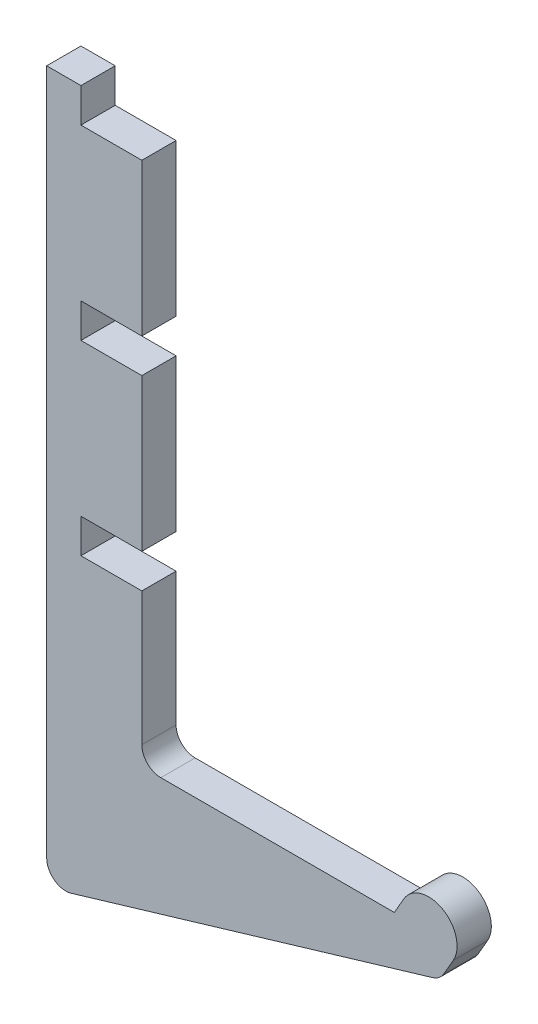
ISO-10303-21;
HEADER;
FILE_DESCRIPTION(('STEP AP214'),'2;1');
FILE_NAME('part.step','',(''),(''),'','','');
FILE_SCHEMA(('AUTOMOTIVE_DESIGN { 1 0 10303 214 1 1 1 1 }'));
ENDSEC;
DATA;
#1=APPLICATION_CONTEXT('core data for automotive mechanical design processes');
#2=APPLICATION_PROTOCOL_DEFINITION('international standard','automotive_design',2000,#1);
#3=PRODUCT_CONTEXT('',#1,'mechanical');
#4=PRODUCT('Part','Part','',(#3));
#5=PRODUCT_RELATED_PRODUCT_CATEGORY('part','',(#4));
#6=PRODUCT_DEFINITION_FORMATION('','',#4);
#7=PRODUCT_DEFINITION_CONTEXT('part definition',#1,'design');
#8=PRODUCT_DEFINITION('design','',#6,#7);
#9=PRODUCT_DEFINITION_SHAPE('','',#8);
#10=(LENGTH_UNIT() NAMED_UNIT(*) SI_UNIT(.MILLI.,.METRE.));
#11=(NAMED_UNIT(*) PLANE_ANGLE_UNIT() SI_UNIT($,.RADIAN.));
#12=(NAMED_UNIT(*) SI_UNIT($,.STERADIAN.) SOLID_ANGLE_UNIT());
#13=UNCERTAINTY_MEASURE_WITH_UNIT(LENGTH_MEASURE(1.E-05),#10,'distance_accuracy_value','');
#14=(GEOMETRIC_REPRESENTATION_CONTEXT(3) GLOBAL_UNCERTAINTY_ASSIGNED_CONTEXT((#13)) GLOBAL_UNIT_ASSIGNED_CONTEXT((#10,
#11,#12)) REPRESENTATION_CONTEXT('',''));
#15=CARTESIAN_POINT('',(0.,0.,0.));
#16=DIRECTION('',(0.,0.,1.));
#17=DIRECTION('',(1.,0.,0.));
#18=AXIS2_PLACEMENT_3D('',#15,#16,#17);
#19=CARTESIAN_POINT('',(200.,310.,18.));
#20=DIRECTION('',(0.,0.,-1.));
#21=DIRECTION('',(-1.,0.,0.));
#22=AXIS2_PLACEMENT_3D('',#19,#20,#21);
#23=CYLINDRICAL_SURFACE('',#22,10.);
#24=DIRECTION('',(0.,0.,1.));
#25=VECTOR('',#24,1.);
#26=CARTESIAN_POINT('',(208.660254037844,305.,0.));
#27=LINE('',#26,#25);
#28=CARTESIAN_POINT('',(208.660254037844,305.,0.));
#29=VERTEX_POINT('',#28);
#30=CARTESIAN_POINT('',(208.660254037844,305.,18.));
#31=VERTEX_POINT('',#30);
#32=EDGE_CURVE('E178',#29,#31,#27,.T.);
#33=ORIENTED_EDGE('',*,*,#32,.T.);
#34=CARTESIAN_POINT('',(200.,310.,18.));
#35=DIRECTION('',(0.,0.,1.));
#36=DIRECTION('',(1.,0.,0.));
#37=AXIS2_PLACEMENT_3D('',#34,#35,#36);
#38=CIRCLE('',#37,10.);
#39=CARTESIAN_POINT('',(202.85438916302,300.416030962799,18.));
#40=VERTEX_POINT('',#39);
#41=EDGE_CURVE('E257',#40,#31,#38,.T.);
#42=ORIENTED_EDGE('',*,*,#41,.F.);
#43=DIRECTION('',(0.,0.,-1.));
#44=VECTOR('',#43,1.);
#45=CARTESIAN_POINT('',(202.85438916302,300.416030962799,18.));
#46=LINE('',#45,#44);
#47=CARTESIAN_POINT('',(202.85438916302,300.416030962799,0.));
#48=VERTEX_POINT('',#47);
#49=EDGE_CURVE('E204',#40,#48,#46,.T.);
#50=ORIENTED_EDGE('',*,*,#49,.T.);
#51=CARTESIAN_POINT('',(200.,310.,0.));
#52=DIRECTION('',(0.,0.,1.));
#53=DIRECTION('',(1.,0.,0.));
#54=AXIS2_PLACEMENT_3D('',#51,#52,#53);
#55=CIRCLE('',#54,10.);
#56=EDGE_CURVE('E197',#48,#29,#55,.T.);
#57=ORIENTED_EDGE('',*,*,#56,.T.);
#58=EDGE_LOOP('',(#33,#42,#50,#57));
#59=FACE_BOUND('',#58,.T.);
#60=ADVANCED_FACE('F34',(#59),#23,.T.);
#61=CARTESIAN_POINT('',(50.,330.,18.));
#62=DIRECTION('',(-1.,0.,0.));
#63=DIRECTION('',(0.,0.,1.));
#64=AXIS2_PLACEMENT_3D('',#61,#62,#63);
#65=PLANE('',#64);
#66=DIRECTION('',(0.,1.,0.));
#67=VECTOR('',#66,1.);
#68=CARTESIAN_POINT('',(50.,330.,0.));
#69=LINE('',#68,#67);
#70=CARTESIAN_POINT('',(50.,330.,0.));
#71=VERTEX_POINT('',#70);
#72=CARTESIAN_POINT('',(50.,400.,0.));
#73=VERTEX_POINT('',#72);
#74=EDGE_CURVE('E216',#71,#73,#69,.T.);
#75=ORIENTED_EDGE('',*,*,#74,.T.);
#76=DIRECTION('',(0.,0.,1.));
#77=VECTOR('',#76,1.);
#78=CARTESIAN_POINT('',(50.,400.,0.));
#79=LINE('',#78,#77);
#80=CARTESIAN_POINT('',(50.,400.,18.));
#81=VERTEX_POINT('',#80);
#82=EDGE_CURVE('E303',#73,#81,#79,.T.);
#83=ORIENTED_EDGE('',*,*,#82,.T.);
#84=DIRECTION('',(0.,1.,0.));
#85=VECTOR('',#84,1.);
#86=CARTESIAN_POINT('',(50.,330.,18.));
#87=LINE('',#86,#85);
#88=CARTESIAN_POINT('',(50.,330.,18.));
#89=VERTEX_POINT('',#88);
#90=EDGE_CURVE('E225',#89,#81,#87,.T.);
#91=ORIENTED_EDGE('',*,*,#90,.F.);
#92=DIRECTION('',(0.,0.,-1.));
#93=VECTOR('',#92,1.);
#94=CARTESIAN_POINT('',(50.,330.,18.));
#95=LINE('',#94,#93);
#96=EDGE_CURVE('E221',#89,#71,#95,.T.);
#97=ORIENTED_EDGE('',*,*,#96,.T.);
#98=EDGE_LOOP('',(#75,#83,#91,#97));
#99=FACE_BOUND('',#98,.T.);
#100=ADVANCED_FACE('F364',(#99),#65,.F.);
#101=CARTESIAN_POINT('',(50.,418.,18.));
#102=VERTEX_POINT('',#101);
#103=CARTESIAN_POINT('',(50.,498.,18.));
#104=VERTEX_POINT('',#103);
#105=EDGE_CURVE('E251',#102,#104,#87,.T.);
#106=ORIENTED_EDGE('',*,*,#105,.F.);
#107=DIRECTION('',(0.,0.,1.));
#108=VECTOR('',#107,1.);
#109=CARTESIAN_POINT('',(50.,418.,0.));
#110=LINE('',#109,#108);
#111=CARTESIAN_POINT('',(50.,418.,0.));
#112=VERTEX_POINT('',#111);
#113=EDGE_CURVE('E311',#112,#102,#110,.T.);
#114=ORIENTED_EDGE('',*,*,#113,.F.);
#115=CARTESIAN_POINT('',(50.,498.,0.));
#116=VERTEX_POINT('',#115);
#117=EDGE_CURVE('E220',#112,#116,#69,.T.);
#118=ORIENTED_EDGE('',*,*,#117,.T.);
#119=DIRECTION('',(0.,0.,1.));
#120=VECTOR('',#119,1.);
#121=CARTESIAN_POINT('',(50.,498.,0.));
#122=LINE('',#121,#120);
#123=EDGE_CURVE('E279',#116,#104,#122,.T.);
#124=ORIENTED_EDGE('',*,*,#123,.T.);
#125=EDGE_LOOP('',(#106,#114,#118,#124));
#126=FACE_BOUND('',#125,.T.);
#127=ADVANCED_FACE('F375',(#126),#65,.F.);
#128=CARTESIAN_POINT('',(50.,614.,18.));
#129=DIRECTION('',(0.,-1.,0.));
#130=DIRECTION('',(0.,0.,-1.));
#131=AXIS2_PLACEMENT_3D('',#128,#129,#130);
#132=PLANE('',#131);
#133=DIRECTION('',(-1.,0.,0.));
#134=VECTOR('',#133,1.);
#135=CARTESIAN_POINT('',(50.,614.,18.));
#136=LINE('',#135,#134);
#137=CARTESIAN_POINT('',(18.0000000000001,614.,18.));
#138=VERTEX_POINT('',#137);
#139=CARTESIAN_POINT('',(0.,614.,18.));
#140=VERTEX_POINT('',#139);
#141=EDGE_CURVE('E219',#138,#140,#136,.T.);
#142=ORIENTED_EDGE('',*,*,#141,.F.);
#143=DIRECTION('',(0.,0.,1.));
#144=VECTOR('',#143,1.);
#145=CARTESIAN_POINT('',(18.0000000000001,614.,0.));
#146=LINE('',#145,#144);
#147=CARTESIAN_POINT('',(18.0000000000001,614.,0.));
#148=VERTEX_POINT('',#147);
#149=EDGE_CURVE('E248',#148,#138,#146,.T.);
#150=ORIENTED_EDGE('',*,*,#149,.F.);
#151=DIRECTION('',(-1.,0.,0.));
#152=VECTOR('',#151,1.);
#153=CARTESIAN_POINT('',(50.,614.,0.));
#154=LINE('',#153,#152);
#155=CARTESIAN_POINT('',(0.,614.,0.));
#156=VERTEX_POINT('',#155);
#157=EDGE_CURVE('E244',#148,#156,#154,.T.);
#158=ORIENTED_EDGE('',*,*,#157,.T.);
#159=DIRECTION('',(0.,0.,-1.));
#160=VECTOR('',#159,1.);
#161=CARTESIAN_POINT('',(0.,614.,18.));
#162=LINE('',#161,#160);
#163=EDGE_CURVE('E11',#140,#156,#162,.T.);
#164=ORIENTED_EDGE('',*,*,#163,.F.);
#165=EDGE_LOOP('',(#142,#150,#158,#164));
#166=FACE_BOUND('',#165,.T.);
#167=ADVANCED_FACE('F36',(#166),#132,.F.);
#168=CARTESIAN_POINT('',(0.,614.,18.));
#169=DIRECTION('',(1.,0.,0.));
#170=DIRECTION('',(0.,1.,0.));
#171=AXIS2_PLACEMENT_3D('',#168,#169,#170);
#172=PLANE('',#171);
#173=DIRECTION('',(0.,-1.,0.));
#174=VECTOR('',#173,1.);
#175=CARTESIAN_POINT('',(0.,614.,0.));
#176=LINE('',#175,#174);
#177=CARTESIAN_POINT('',(0.,253.412385946913,0.));
#178=VERTEX_POINT('',#177);
#179=EDGE_CURVE('E243',#156,#178,#176,.T.);
#180=ORIENTED_EDGE('',*,*,#179,.T.);
#181=DIRECTION('',(0.,0.,-1.));
#182=VECTOR('',#181,1.);
#183=CARTESIAN_POINT('',(0.,253.412385946913,18.));
#184=LINE('',#183,#182);
#185=CARTESIAN_POINT('',(0.,253.412385946913,18.));
#186=VERTEX_POINT('',#185);
#187=EDGE_CURVE('E42',#186,#178,#184,.T.);
#188=ORIENTED_EDGE('',*,*,#187,.F.);
#189=DIRECTION('',(0.,-1.,0.));
#190=VECTOR('',#189,1.);
#191=CARTESIAN_POINT('',(0.,614.,18.));
#192=LINE('',#191,#190);
#193=EDGE_CURVE('E262',#140,#186,#192,.T.);
#194=ORIENTED_EDGE('',*,*,#193,.F.);
#195=ORIENTED_EDGE('',*,*,#163,.T.);
#196=EDGE_LOOP('',(#180,#188,#194,#195));
#197=FACE_BOUND('',#196,.T.);
#198=ADVANCED_FACE('F397',(#197),#172,.F.);
#199=CARTESIAN_POINT('',(10.0000000000001,253.412385946913,18.));
#200=DIRECTION('',(0.,0.,-1.));
#201=DIRECTION('',(-1.,0.,0.));
#202=AXIS2_PLACEMENT_3D('',#199,#200,#201);
#203=CYLINDRICAL_SURFACE('',#202,9.99999999999998);
#204=CARTESIAN_POINT('',(10.0000000000001,253.412385946913,0.));
#205=DIRECTION('',(0.,0.,1.));
#206=DIRECTION('',(1.,0.,0.));
#207=AXIS2_PLACEMENT_3D('',#204,#205,#206);
#208=CIRCLE('',#207,9.99999999999998);
#209=CARTESIAN_POINT('',(12.8543891630206,243.828416909712,0.));
#210=VERTEX_POINT('',#209);
#211=EDGE_CURVE('E210',#178,#210,#208,.T.);
#212=ORIENTED_EDGE('',*,*,#211,.T.);
#213=DIRECTION('',(0.,0.,-1.));
#214=VECTOR('',#213,1.);
#215=CARTESIAN_POINT('',(12.8543891630206,243.828416909712,18.));
#216=LINE('',#215,#214);
#217=CARTESIAN_POINT('',(12.8543891630206,243.828416909712,18.));
#218=VERTEX_POINT('',#217);
#219=EDGE_CURVE('E229',#218,#210,#216,.T.);
#220=ORIENTED_EDGE('',*,*,#219,.F.);
#221=CARTESIAN_POINT('',(10.0000000000001,253.412385946913,18.));
#222=DIRECTION('',(0.,0.,1.));
#223=DIRECTION('',(1.,0.,0.));
#224=AXIS2_PLACEMENT_3D('',#221,#222,#223);
#225=CIRCLE('',#224,9.99999999999998);
#226=EDGE_CURVE('E238',#186,#218,#225,.T.);
#227=ORIENTED_EDGE('',*,*,#226,.F.);
#228=ORIENTED_EDGE('',*,*,#187,.T.);
#229=EDGE_LOOP('',(#212,#220,#227,#228));
#230=FACE_BOUND('',#229,.T.);
#231=ADVANCED_FACE('F236',(#230),#203,.T.);
#232=CARTESIAN_POINT('',(12.8543891630206,243.828416909712,18.));
#233=DIRECTION('',(-0.285438916302043,0.958396903720121,0.));
#234=DIRECTION('',(-0.958396903720121,-0.285438916302043,0.));
#235=AXIS2_PLACEMENT_3D('',#232,#233,#234);
#236=PLANE('',#235);
#237=DIRECTION('',(0.958396903720121,0.285438916302043,0.));
#238=VECTOR('',#237,1.);
#239=CARTESIAN_POINT('',(12.8543891630206,243.828416909712,0.));
#240=LINE('',#239,#238);
#241=EDGE_CURVE('E206',#210,#48,#240,.T.);
#242=ORIENTED_EDGE('',*,*,#241,.T.);
#243=ORIENTED_EDGE('',*,*,#49,.F.);
#244=DIRECTION('',(0.958396903720121,0.285438916302043,0.));
#245=VECTOR('',#244,1.);
#246=CARTESIAN_POINT('',(12.8543891630206,243.828416909712,18.));
#247=LINE('',#246,#245);
#248=EDGE_CURVE('E259',#218,#40,#247,.T.);
#249=ORIENTED_EDGE('',*,*,#248,.F.);
#250=ORIENTED_EDGE('',*,*,#219,.T.);
#251=EDGE_LOOP('',(#242,#243,#249,#250));
#252=FACE_BOUND('',#251,.T.);
#253=ADVANCED_FACE('F403',(#252),#236,.F.);
#254=CARTESIAN_POINT('',(200.,320.,18.));
#255=DIRECTION('',(0.,-1.,0.));
#256=DIRECTION('',(0.,0.,-1.));
#257=AXIS2_PLACEMENT_3D('',#254,#255,#256);
#258=PLANE('',#257);
#259=DIRECTION('',(-1.,0.,0.));
#260=VECTOR('',#259,1.);
#261=CARTESIAN_POINT('',(200.,320.,18.));
#262=LINE('',#261,#260);
#263=CARTESIAN_POINT('',(182.679491924311,320.,18.));
#264=VERTEX_POINT('',#263);
#265=CARTESIAN_POINT('',(60.0000000000001,320.,18.));
#266=VERTEX_POINT('',#265);
#267=EDGE_CURVE('E255',#264,#266,#262,.T.);
#268=ORIENTED_EDGE('',*,*,#267,.F.);
#269=DIRECTION('',(0.,0.,1.));
#270=VECTOR('',#269,1.);
#271=CARTESIAN_POINT('',(182.679491924311,320.,0.));
#272=LINE('',#271,#270);
#273=CARTESIAN_POINT('',(182.679491924311,320.,0.));
#274=VERTEX_POINT('',#273);
#275=EDGE_CURVE('E329',#274,#264,#272,.T.);
#276=ORIENTED_EDGE('',*,*,#275,.F.);
#277=DIRECTION('',(-1.,0.,0.));
#278=VECTOR('',#277,1.);
#279=CARTESIAN_POINT('',(200.,320.,0.));
#280=LINE('',#279,#278);
#281=CARTESIAN_POINT('',(60.0000000000001,320.,0.));
#282=VERTEX_POINT('',#281);
#283=EDGE_CURVE('E205',#274,#282,#280,.T.);
#284=ORIENTED_EDGE('',*,*,#283,.T.);
#285=DIRECTION('',(0.,0.,-1.));
#286=VECTOR('',#285,1.);
#287=CARTESIAN_POINT('',(60.0000000000001,320.,18.));
#288=LINE('',#287,#286);
#289=EDGE_CURVE('E224',#266,#282,#288,.T.);
#290=ORIENTED_EDGE('',*,*,#289,.F.);
#291=EDGE_LOOP('',(#268,#276,#284,#290));
#292=FACE_BOUND('',#291,.T.);
#293=ADVANCED_FACE('F353',(#292),#258,.F.);
#294=CARTESIAN_POINT('',(60.,330.,18.));
#295=DIRECTION('',(0.,0.,-1.));
#296=DIRECTION('',(-1.,0.,0.));
#297=AXIS2_PLACEMENT_3D('',#294,#295,#296);
#298=CYLINDRICAL_SURFACE('',#297,10.);
#299=CARTESIAN_POINT('',(60.,330.,0.));
#300=DIRECTION('',(0.,0.,-1.));
#301=DIRECTION('',(-1.,0.,0.));
#302=AXIS2_PLACEMENT_3D('',#299,#300,#301);
#303=CIRCLE('',#302,10.);
#304=EDGE_CURVE('E208',#282,#71,#303,.T.);
#305=ORIENTED_EDGE('',*,*,#304,.T.);
#306=ORIENTED_EDGE('',*,*,#96,.F.);
#307=CARTESIAN_POINT('',(60.,330.,18.));
#308=DIRECTION('',(0.,0.,-1.));
#309=DIRECTION('',(-1.,0.,0.));
#310=AXIS2_PLACEMENT_3D('',#307,#308,#309);
#311=CIRCLE('',#310,10.);
#312=EDGE_CURVE('E253',#266,#89,#311,.T.);
#313=ORIENTED_EDGE('',*,*,#312,.F.);
#314=ORIENTED_EDGE('',*,*,#289,.T.);
#315=EDGE_LOOP('',(#305,#306,#313,#314));
#316=FACE_BOUND('',#315,.T.);
#317=ADVANCED_FACE('F361',(#316),#298,.F.);
#318=CARTESIAN_POINT('',(50.,516.,18.));
#319=VERTEX_POINT('',#318);
#320=CARTESIAN_POINT('',(50.,596.,18.));
#321=VERTEX_POINT('',#320);
#322=EDGE_CURVE('E252',#319,#321,#87,.T.);
#323=ORIENTED_EDGE('',*,*,#322,.F.);
#324=DIRECTION('',(0.,0.,1.));
#325=VECTOR('',#324,1.);
#326=CARTESIAN_POINT('',(50.,516.,0.));
#327=LINE('',#326,#325);
#328=CARTESIAN_POINT('',(50.,516.,0.));
#329=VERTEX_POINT('',#328);
#330=EDGE_CURVE('E284',#329,#319,#327,.T.);
#331=ORIENTED_EDGE('',*,*,#330,.F.);
#332=CARTESIAN_POINT('',(50.,596.,0.));
#333=VERTEX_POINT('',#332);
#334=EDGE_CURVE('E215',#329,#333,#69,.T.);
#335=ORIENTED_EDGE('',*,*,#334,.T.);
#336=DIRECTION('',(0.,0.,1.));
#337=VECTOR('',#336,1.);
#338=CARTESIAN_POINT('',(50.,596.,0.));
#339=LINE('',#338,#337);
#340=EDGE_CURVE('E267',#333,#321,#339,.T.);
#341=ORIENTED_EDGE('',*,*,#340,.T.);
#342=EDGE_LOOP('',(#323,#331,#335,#341));
#343=FACE_BOUND('',#342,.T.);
#344=ADVANCED_FACE('F389',(#343),#65,.F.);
#345=CARTESIAN_POINT('',(10.0000000000001,253.412385946913,18.));
#346=DIRECTION('',(0.,0.,1.));
#347=DIRECTION('',(1.,0.,0.));
#348=AXIS2_PLACEMENT_3D('',#345,#346,#347);
#349=PLANE('',#348);
#350=ORIENTED_EDGE('',*,*,#41,.T.);
#351=DIRECTION('',(0.499999999999984,0.866025403784448,0.));
#352=VECTOR('',#351,1.);
#353=CARTESIAN_POINT('',(208.660254037844,305.,18.));
#354=LINE('',#353,#352);
#355=CARTESIAN_POINT('',(213.660254037844,313.660254037844,18.));
#356=VERTEX_POINT('',#355);
#357=EDGE_CURVE('E183',#31,#356,#354,.T.);
#358=ORIENTED_EDGE('',*,*,#357,.T.);
#359=CARTESIAN_POINT('',(200.669872981078,321.160254037844,18.));
#360=DIRECTION('',(0.,0.,1.));
#361=DIRECTION('',(-1.,0.,0.));
#362=AXIS2_PLACEMENT_3D('',#359,#360,#361);
#363=CIRCLE('',#362,14.9999999999999);
#364=CARTESIAN_POINT('',(187.679491924311,328.660254037844,18.));
#365=VERTEX_POINT('',#364);
#366=EDGE_CURVE('E340',#356,#365,#363,.T.);
#367=ORIENTED_EDGE('',*,*,#366,.T.);
#368=DIRECTION('',(-0.500000000000003,-0.866025403784437,0.));
#369=VECTOR('',#368,1.);
#370=CARTESIAN_POINT('',(187.679491924311,328.660254037844,18.));
#371=LINE('',#370,#369);
#372=EDGE_CURVE('E49',#365,#264,#371,.T.);
#373=ORIENTED_EDGE('',*,*,#372,.T.);
#374=ORIENTED_EDGE('',*,*,#267,.T.);
#375=ORIENTED_EDGE('',*,*,#312,.T.);
#376=ORIENTED_EDGE('',*,*,#90,.T.);
#377=DIRECTION('',(1.,0.,0.));
#378=VECTOR('',#377,1.);
#379=CARTESIAN_POINT('',(50.,400.,18.));
#380=LINE('',#379,#378);
#381=CARTESIAN_POINT('',(18.0000000000001,400.,18.));
#382=VERTEX_POINT('',#381);
#383=EDGE_CURVE('E320',#382,#81,#380,.T.);
#384=ORIENTED_EDGE('',*,*,#383,.F.);
#385=DIRECTION('',(0.,-1.,0.));
#386=VECTOR('',#385,1.);
#387=CARTESIAN_POINT('',(18.0000000000001,418.,18.));
#388=LINE('',#387,#386);
#389=CARTESIAN_POINT('',(18.0000000000001,418.,18.));
#390=VERTEX_POINT('',#389);
#391=EDGE_CURVE('E323',#390,#382,#388,.T.);
#392=ORIENTED_EDGE('',*,*,#391,.F.);
#393=DIRECTION('',(-1.,0.,0.));
#394=VECTOR('',#393,1.);
#395=CARTESIAN_POINT('',(50.,418.,18.));
#396=LINE('',#395,#394);
#397=EDGE_CURVE('E326',#102,#390,#396,.T.);
#398=ORIENTED_EDGE('',*,*,#397,.F.);
#399=ORIENTED_EDGE('',*,*,#105,.T.);
#400=DIRECTION('',(1.,0.,0.));
#401=VECTOR('',#400,1.);
#402=CARTESIAN_POINT('',(50.,498.,18.));
#403=LINE('',#402,#401);
#404=CARTESIAN_POINT('',(18.0000000000001,498.,18.));
#405=VERTEX_POINT('',#404);
#406=EDGE_CURVE('E293',#405,#104,#403,.T.);
#407=ORIENTED_EDGE('',*,*,#406,.F.);
#408=DIRECTION('',(0.,-1.,0.));
#409=VECTOR('',#408,1.);
#410=CARTESIAN_POINT('',(18.0000000000001,516.,18.));
#411=LINE('',#410,#409);
#412=CARTESIAN_POINT('',(18.0000000000001,516.,18.));
#413=VERTEX_POINT('',#412);
#414=EDGE_CURVE('E297',#413,#405,#411,.T.);
#415=ORIENTED_EDGE('',*,*,#414,.F.);
#416=DIRECTION('',(-1.,0.,0.));
#417=VECTOR('',#416,1.);
#418=CARTESIAN_POINT('',(50.,516.,18.));
#419=LINE('',#418,#417);
#420=EDGE_CURVE('E300',#319,#413,#419,.T.);
#421=ORIENTED_EDGE('',*,*,#420,.F.);
#422=ORIENTED_EDGE('',*,*,#322,.T.);
#423=DIRECTION('',(1.,0.,0.));
#424=VECTOR('',#423,1.);
#425=CARTESIAN_POINT('',(18.0000000000001,596.,18.));
#426=LINE('',#425,#424);
#427=CARTESIAN_POINT('',(18.0000000000001,596.,18.));
#428=VERTEX_POINT('',#427);
#429=EDGE_CURVE('E272',#428,#321,#426,.T.);
#430=ORIENTED_EDGE('',*,*,#429,.F.);
#431=DIRECTION('',(0.,-1.,0.));
#432=VECTOR('',#431,1.);
#433=CARTESIAN_POINT('',(18.0000000000001,596.,18.));
#434=LINE('',#433,#432);
#435=EDGE_CURVE('E276',#138,#428,#434,.T.);
#436=ORIENTED_EDGE('',*,*,#435,.F.);
#437=ORIENTED_EDGE('',*,*,#141,.T.);
#438=ORIENTED_EDGE('',*,*,#193,.T.);
#439=ORIENTED_EDGE('',*,*,#226,.T.);
#440=ORIENTED_EDGE('',*,*,#248,.T.);
#441=EDGE_LOOP('',(#350,#358,#367,#373,#374,#375,#376,#384,#392,#398,#399,#407,#415,#421,#422,
#430,#436,#437,#438,#439,#440));
#442=FACE_BOUND('',#441,.T.);
#443=ADVANCED_FACE('F356',(#442),#349,.T.);
#444=CARTESIAN_POINT('',(10.0000000000001,253.412385946913,0.));
#445=DIRECTION('',(0.,0.,1.));
#446=DIRECTION('',(1.,0.,0.));
#447=AXIS2_PLACEMENT_3D('',#444,#445,#446);
#448=PLANE('',#447);
#449=ORIENTED_EDGE('',*,*,#283,.F.);
#450=DIRECTION('',(-0.500000000000003,-0.866025403784437,0.));
#451=VECTOR('',#450,1.);
#452=CARTESIAN_POINT('',(187.679491924311,328.660254037844,0.));
#453=LINE('',#452,#451);
#454=CARTESIAN_POINT('',(187.679491924311,328.660254037844,0.));
#455=VERTEX_POINT('',#454);
#456=EDGE_CURVE('E189',#455,#274,#453,.T.);
#457=ORIENTED_EDGE('',*,*,#456,.F.);
#458=CARTESIAN_POINT('',(200.669872981078,321.160254037844,0.));
#459=DIRECTION('',(0.,0.,1.));
#460=DIRECTION('',(-1.,0.,0.));
#461=AXIS2_PLACEMENT_3D('',#458,#459,#460);
#462=CIRCLE('',#461,14.9999999999999);
#463=CARTESIAN_POINT('',(213.660254037844,313.660254037844,0.));
#464=VERTEX_POINT('',#463);
#465=EDGE_CURVE('E200',#464,#455,#462,.T.);
#466=ORIENTED_EDGE('',*,*,#465,.F.);
#467=DIRECTION('',(0.499999999999984,0.866025403784448,0.));
#468=VECTOR('',#467,1.);
#469=CARTESIAN_POINT('',(208.660254037844,305.,0.));
#470=LINE('',#469,#468);
#471=EDGE_CURVE('E181',#29,#464,#470,.T.);
#472=ORIENTED_EDGE('',*,*,#471,.F.);
#473=ORIENTED_EDGE('',*,*,#56,.F.);
#474=ORIENTED_EDGE('',*,*,#241,.F.);
#475=ORIENTED_EDGE('',*,*,#211,.F.);
#476=ORIENTED_EDGE('',*,*,#179,.F.);
#477=ORIENTED_EDGE('',*,*,#157,.F.);
#478=DIRECTION('',(0.,-1.,0.));
#479=VECTOR('',#478,1.);
#480=CARTESIAN_POINT('',(18.0000000000001,596.,0.));
#481=LINE('',#480,#479);
#482=CARTESIAN_POINT('',(18.0000000000001,596.,0.));
#483=VERTEX_POINT('',#482);
#484=EDGE_CURVE('E275',#148,#483,#481,.T.);
#485=ORIENTED_EDGE('',*,*,#484,.T.);
#486=DIRECTION('',(1.,0.,0.));
#487=VECTOR('',#486,1.);
#488=CARTESIAN_POINT('',(18.0000000000001,596.,0.));
#489=LINE('',#488,#487);
#490=EDGE_CURVE('E268',#483,#333,#489,.T.);
#491=ORIENTED_EDGE('',*,*,#490,.T.);
#492=ORIENTED_EDGE('',*,*,#334,.F.);
#493=DIRECTION('',(-1.,0.,0.));
#494=VECTOR('',#493,1.);
#495=CARTESIAN_POINT('',(50.,516.,0.));
#496=LINE('',#495,#494);
#497=CARTESIAN_POINT('',(18.0000000000001,516.,0.));
#498=VERTEX_POINT('',#497);
#499=EDGE_CURVE('E296',#329,#498,#496,.T.);
#500=ORIENTED_EDGE('',*,*,#499,.T.);
#501=DIRECTION('',(0.,-1.,0.));
#502=VECTOR('',#501,1.);
#503=CARTESIAN_POINT('',(18.0000000000001,516.,0.));
#504=LINE('',#503,#502);
#505=CARTESIAN_POINT('',(18.0000000000001,498.,0.));
#506=VERTEX_POINT('',#505);
#507=EDGE_CURVE('E306',#498,#506,#504,.T.);
#508=ORIENTED_EDGE('',*,*,#507,.T.);
#509=DIRECTION('',(1.,0.,0.));
#510=VECTOR('',#509,1.);
#511=CARTESIAN_POINT('',(50.,498.,0.));
#512=LINE('',#511,#510);
#513=EDGE_CURVE('E287',#506,#116,#512,.T.);
#514=ORIENTED_EDGE('',*,*,#513,.T.);
#515=ORIENTED_EDGE('',*,*,#117,.F.);
#516=DIRECTION('',(-1.,0.,0.));
#517=VECTOR('',#516,1.);
#518=CARTESIAN_POINT('',(50.,418.,0.));
#519=LINE('',#518,#517);
#520=CARTESIAN_POINT('',(18.0000000000001,418.,0.));
#521=VERTEX_POINT('',#520);
#522=EDGE_CURVE('E322',#112,#521,#519,.T.);
#523=ORIENTED_EDGE('',*,*,#522,.T.);
#524=DIRECTION('',(0.,-1.,0.));
#525=VECTOR('',#524,1.);
#526=CARTESIAN_POINT('',(18.0000000000001,418.,0.));
#527=LINE('',#526,#525);
#528=CARTESIAN_POINT('',(18.0000000000001,400.,0.));
#529=VERTEX_POINT('',#528);
#530=EDGE_CURVE('E57',#521,#529,#527,.T.);
#531=ORIENTED_EDGE('',*,*,#530,.T.);
#532=DIRECTION('',(1.,0.,0.));
#533=VECTOR('',#532,1.);
#534=CARTESIAN_POINT('',(50.,400.,0.));
#535=LINE('',#534,#533);
#536=EDGE_CURVE('E314',#529,#73,#535,.T.);
#537=ORIENTED_EDGE('',*,*,#536,.T.);
#538=ORIENTED_EDGE('',*,*,#74,.F.);
#539=ORIENTED_EDGE('',*,*,#304,.F.);
#540=EDGE_LOOP('',(#449,#457,#466,#472,#473,#474,#475,#476,#477,#485,#491,#492,#500,#508,#514,
#515,#523,#531,#537,#538,#539));
#541=FACE_BOUND('',#540,.T.);
#542=ADVANCED_FACE('F195',(#541),#448,.F.);
#543=CARTESIAN_POINT('',(18.0000000000001,596.,0.));
#544=DIRECTION('',(-1.,0.,0.));
#545=DIRECTION('',(0.,0.,1.));
#546=AXIS2_PLACEMENT_3D('',#543,#544,#545);
#547=PLANE('',#546);
#548=ORIENTED_EDGE('',*,*,#435,.T.);
#549=DIRECTION('',(0.,0.,1.));
#550=VECTOR('',#549,1.);
#551=CARTESIAN_POINT('',(18.0000000000001,596.,0.));
#552=LINE('',#551,#550);
#553=EDGE_CURVE('E265',#483,#428,#552,.T.);
#554=ORIENTED_EDGE('',*,*,#553,.F.);
#555=ORIENTED_EDGE('',*,*,#484,.F.);
#556=ORIENTED_EDGE('',*,*,#149,.T.);
#557=EDGE_LOOP('',(#548,#554,#555,#556));
#558=FACE_BOUND('',#557,.T.);
#559=ADVANCED_FACE('F393',(#558),#547,.F.);
#560=CARTESIAN_POINT('',(18.0000000000001,596.,0.));
#561=DIRECTION('',(0.,-1.,0.));
#562=DIRECTION('',(0.,0.,-1.));
#563=AXIS2_PLACEMENT_3D('',#560,#561,#562);
#564=PLANE('',#563);
#565=ORIENTED_EDGE('',*,*,#429,.T.);
#566=ORIENTED_EDGE('',*,*,#340,.F.);
#567=ORIENTED_EDGE('',*,*,#490,.F.);
#568=ORIENTED_EDGE('',*,*,#553,.T.);
#569=EDGE_LOOP('',(#565,#566,#567,#568));
#570=FACE_BOUND('',#569,.T.);
#571=ADVANCED_FACE('F387',(#570),#564,.F.);
#572=CARTESIAN_POINT('',(50.,498.,0.));
#573=DIRECTION('',(0.,-1.,0.));
#574=DIRECTION('',(0.,0.,-1.));
#575=AXIS2_PLACEMENT_3D('',#572,#573,#574);
#576=PLANE('',#575);
#577=ORIENTED_EDGE('',*,*,#406,.T.);
#578=ORIENTED_EDGE('',*,*,#123,.F.);
#579=ORIENTED_EDGE('',*,*,#513,.F.);
#580=DIRECTION('',(0.,0.,1.));
#581=VECTOR('',#580,1.);
#582=CARTESIAN_POINT('',(18.0000000000001,498.,0.));
#583=LINE('',#582,#581);
#584=EDGE_CURVE('E289',#506,#405,#583,.T.);
#585=ORIENTED_EDGE('',*,*,#584,.T.);
#586=EDGE_LOOP('',(#577,#578,#579,#585));
#587=FACE_BOUND('',#586,.T.);
#588=ADVANCED_FACE('F435',(#587),#576,.F.);
#589=CARTESIAN_POINT('',(18.0000000000001,516.,0.));
#590=DIRECTION('',(-1.,0.,0.));
#591=DIRECTION('',(0.,0.,1.));
#592=AXIS2_PLACEMENT_3D('',#589,#590,#591);
#593=PLANE('',#592);
#594=ORIENTED_EDGE('',*,*,#414,.T.);
#595=ORIENTED_EDGE('',*,*,#584,.F.);
#596=ORIENTED_EDGE('',*,*,#507,.F.);
#597=DIRECTION('',(0.,0.,1.));
#598=VECTOR('',#597,1.);
#599=CARTESIAN_POINT('',(18.0000000000001,516.,0.));
#600=LINE('',#599,#598);
#601=EDGE_CURVE('E286',#498,#413,#600,.T.);
#602=ORIENTED_EDGE('',*,*,#601,.T.);
#603=EDGE_LOOP('',(#594,#595,#596,#602));
#604=FACE_BOUND('',#603,.T.);
#605=ADVANCED_FACE('F439',(#604),#593,.F.);
#606=CARTESIAN_POINT('',(50.,516.,0.));
#607=DIRECTION('',(0.,1.,0.));
#608=DIRECTION('',(0.,0.,1.));
#609=AXIS2_PLACEMENT_3D('',#606,#607,#608);
#610=PLANE('',#609);
#611=ORIENTED_EDGE('',*,*,#420,.T.);
#612=ORIENTED_EDGE('',*,*,#601,.F.);
#613=ORIENTED_EDGE('',*,*,#499,.F.);
#614=ORIENTED_EDGE('',*,*,#330,.T.);
#615=EDGE_LOOP('',(#611,#612,#613,#614));
#616=FACE_BOUND('',#615,.T.);
#617=ADVANCED_FACE('F436',(#616),#610,.F.);
#618=CARTESIAN_POINT('',(50.,400.,0.));
#619=DIRECTION('',(0.,-1.,0.));
#620=DIRECTION('',(0.,0.,-1.));
#621=AXIS2_PLACEMENT_3D('',#618,#619,#620);
#622=PLANE('',#621);
#623=ORIENTED_EDGE('',*,*,#383,.T.);
#624=ORIENTED_EDGE('',*,*,#82,.F.);
#625=ORIENTED_EDGE('',*,*,#536,.F.);
#626=DIRECTION('',(0.,0.,1.));
#627=VECTOR('',#626,1.);
#628=CARTESIAN_POINT('',(18.0000000000001,400.,0.));
#629=LINE('',#628,#627);
#630=EDGE_CURVE('E316',#529,#382,#629,.T.);
#631=ORIENTED_EDGE('',*,*,#630,.T.);
#632=EDGE_LOOP('',(#623,#624,#625,#631));
#633=FACE_BOUND('',#632,.T.);
#634=ADVANCED_FACE('F367',(#633),#622,.F.);
#635=CARTESIAN_POINT('',(18.0000000000001,418.,0.));
#636=DIRECTION('',(-1.,0.,0.));
#637=DIRECTION('',(0.,0.,1.));
#638=AXIS2_PLACEMENT_3D('',#635,#636,#637);
#639=PLANE('',#638);
#640=ORIENTED_EDGE('',*,*,#391,.T.);
#641=ORIENTED_EDGE('',*,*,#630,.F.);
#642=ORIENTED_EDGE('',*,*,#530,.F.);
#643=DIRECTION('',(0.,0.,1.));
#644=VECTOR('',#643,1.);
#645=CARTESIAN_POINT('',(18.0000000000001,418.,0.));
#646=LINE('',#645,#644);
#647=EDGE_CURVE('E313',#521,#390,#646,.T.);
#648=ORIENTED_EDGE('',*,*,#647,.T.);
#649=EDGE_LOOP('',(#640,#641,#642,#648));
#650=FACE_BOUND('',#649,.T.);
#651=ADVANCED_FACE('F449',(#650),#639,.F.);
#652=CARTESIAN_POINT('',(50.,418.,0.));
#653=DIRECTION('',(0.,1.,0.));
#654=DIRECTION('',(0.,0.,1.));
#655=AXIS2_PLACEMENT_3D('',#652,#653,#654);
#656=PLANE('',#655);
#657=ORIENTED_EDGE('',*,*,#397,.T.);
#658=ORIENTED_EDGE('',*,*,#647,.F.);
#659=ORIENTED_EDGE('',*,*,#522,.F.);
#660=ORIENTED_EDGE('',*,*,#113,.T.);
#661=EDGE_LOOP('',(#657,#658,#659,#660));
#662=FACE_BOUND('',#661,.T.);
#663=ADVANCED_FACE('F371',(#662),#656,.F.);
#664=CARTESIAN_POINT('',(187.679491924311,328.660254037844,0.));
#665=DIRECTION('',(-0.866025403784437,0.500000000000003,0.));
#666=DIRECTION('',(-0.500000000000003,-0.866025403784437,0.));
#667=AXIS2_PLACEMENT_3D('',#664,#665,#666);
#668=PLANE('',#667);
#669=ORIENTED_EDGE('',*,*,#372,.F.);
#670=DIRECTION('',(0.,0.,1.));
#671=VECTOR('',#670,1.);
#672=CARTESIAN_POINT('',(187.679491924311,328.660254037844,0.));
#673=LINE('',#672,#671);
#674=EDGE_CURVE('E336',#455,#365,#673,.T.);
#675=ORIENTED_EDGE('',*,*,#674,.F.);
#676=ORIENTED_EDGE('',*,*,#456,.T.);
#677=ORIENTED_EDGE('',*,*,#275,.T.);
#678=EDGE_LOOP('',(#669,#675,#676,#677));
#679=FACE_BOUND('',#678,.T.);
#680=ADVANCED_FACE('F350',(#679),#668,.T.);
#681=CARTESIAN_POINT('',(200.669872981078,321.160254037844,0.));
#682=DIRECTION('',(0.,0.,1.));
#683=DIRECTION('',(1.,0.,0.));
#684=AXIS2_PLACEMENT_3D('',#681,#682,#683);
#685=CYLINDRICAL_SURFACE('',#684,14.9999999999999);
#686=ORIENTED_EDGE('',*,*,#366,.F.);
#687=DIRECTION('',(0.,0.,1.));
#688=VECTOR('',#687,1.);
#689=CARTESIAN_POINT('',(213.660254037844,313.660254037844,0.));
#690=LINE('',#689,#688);
#691=EDGE_CURVE('E188',#464,#356,#690,.T.);
#692=ORIENTED_EDGE('',*,*,#691,.F.);
#693=ORIENTED_EDGE('',*,*,#465,.T.);
#694=ORIENTED_EDGE('',*,*,#674,.T.);
#695=EDGE_LOOP('',(#686,#692,#693,#694));
#696=FACE_BOUND('',#695,.T.);
#697=ADVANCED_FACE('F346',(#696),#685,.T.);
#698=CARTESIAN_POINT('',(208.660254037844,305.,0.));
#699=DIRECTION('',(0.866025403784448,-0.499999999999984,0.));
#700=DIRECTION('',(0.499999999999984,0.866025403784448,0.));
#701=AXIS2_PLACEMENT_3D('',#698,#699,#700);
#702=PLANE('',#701);
#703=ORIENTED_EDGE('',*,*,#357,.F.);
#704=ORIENTED_EDGE('',*,*,#32,.F.);
#705=ORIENTED_EDGE('',*,*,#471,.T.);
#706=ORIENTED_EDGE('',*,*,#691,.T.);
#707=EDGE_LOOP('',(#703,#704,#705,#706));
#708=FACE_BOUND('',#707,.T.);
#709=ADVANCED_FACE('F180',(#708),#702,.T.);
#710=CLOSED_SHELL('',(#60,#100,#127,#167,#198,#231,#253,#293,#317,#344,#443,#542,#559,#571,#588,
#605,#617,#634,#651,#663,#680,#697,#709));
#711=MANIFOLD_SOLID_BREP('B2',#710);
#712=ADVANCED_BREP_SHAPE_REPRESENTATION('',(#18,#711),#14);
#713=SHAPE_DEFINITION_REPRESENTATION(#9,#712);
ENDSEC;
END-ISO-10303-21;
